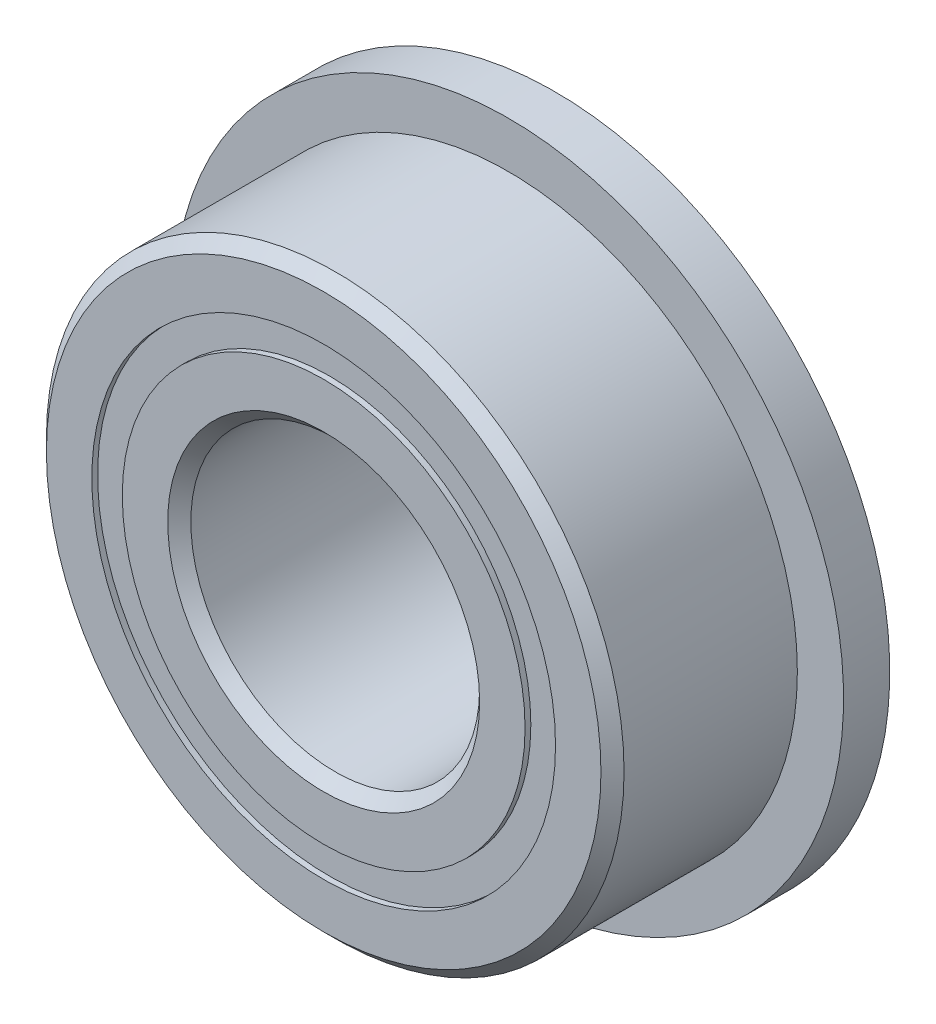
ISO-10303-21;
HEADER;
FILE_DESCRIPTION(('STEP AP214'),'2;1');
FILE_NAME('part.step','',(''),(''),'','','');
FILE_SCHEMA(('AUTOMOTIVE_DESIGN { 1 0 10303 214 1 1 1 1 }'));
ENDSEC;
DATA;
#1=APPLICATION_CONTEXT('core data for automotive mechanical design processes');
#2=APPLICATION_PROTOCOL_DEFINITION('international standard','automotive_design',2000,#1);
#3=PRODUCT_CONTEXT('',#1,'mechanical');
#4=PRODUCT('Part','Part','',(#3));
#5=PRODUCT_RELATED_PRODUCT_CATEGORY('part','',(#4));
#6=PRODUCT_DEFINITION_FORMATION('','',#4);
#7=PRODUCT_DEFINITION_CONTEXT('part definition',#1,'design');
#8=PRODUCT_DEFINITION('design','',#6,#7);
#9=PRODUCT_DEFINITION_SHAPE('','',#8);
#10=(LENGTH_UNIT() NAMED_UNIT(*) SI_UNIT(.MILLI.,.METRE.));
#11=(NAMED_UNIT(*) PLANE_ANGLE_UNIT() SI_UNIT($,.RADIAN.));
#12=(NAMED_UNIT(*) SI_UNIT($,.STERADIAN.) SOLID_ANGLE_UNIT());
#13=UNCERTAINTY_MEASURE_WITH_UNIT(LENGTH_MEASURE(1.E-05),#10,'distance_accuracy_value','');
#14=(GEOMETRIC_REPRESENTATION_CONTEXT(3) GLOBAL_UNCERTAINTY_ASSIGNED_CONTEXT((#13)) GLOBAL_UNIT_ASSIGNED_CONTEXT((#10,
#11,#12)) REPRESENTATION_CONTEXT('',''));
#15=CARTESIAN_POINT('',(0.,0.,0.));
#16=DIRECTION('',(0.,0.,1.));
#17=DIRECTION('',(1.,0.,0.));
#18=AXIS2_PLACEMENT_3D('',#15,#16,#17);
#19=CARTESIAN_POINT('',(0.,4.01373626373626,-1.9));
#20=DIRECTION('',(0.,0.,1.));
#21=DIRECTION('',(1.,0.,0.));
#22=AXIS2_PLACEMENT_3D('',#19,#20,#21);
#23=PLANE('',#22);
#24=CARTESIAN_POINT('',(0.,0.,-1.9));
#25=DIRECTION('',(0.,0.,1.));
#26=DIRECTION('',(1.,0.,0.));
#27=AXIS2_PLACEMENT_3D('',#24,#25,#26);
#28=CIRCLE('',#27,4.01373626373626);
#29=CARTESIAN_POINT('',(4.01373626373626,0.,-1.9));
#30=VERTEX_POINT('',#29);
#31=EDGE_CURVE('E57',#30,#30,#28,.T.);
#32=ORIENTED_EDGE('',*,*,#31,.F.);
#33=EDGE_LOOP('',(#32));
#34=FACE_BOUND('',#33,.T.);
#35=CARTESIAN_POINT('',(0.,0.,-1.9));
#36=DIRECTION('',(0.,0.,1.));
#37=DIRECTION('',(1.,0.,0.));
#38=AXIS2_PLACEMENT_3D('',#35,#36,#37);
#39=CIRCLE('',#38,3.48626373626374);
#40=CARTESIAN_POINT('',(3.48626373626374,0.,-1.9));
#41=VERTEX_POINT('',#40);
#42=EDGE_CURVE('E11',#41,#41,#39,.T.);
#43=ORIENTED_EDGE('',*,*,#42,.T.);
#44=EDGE_LOOP('',(#43));
#45=FACE_BOUND('',#44,.T.);
#46=ADVANCED_FACE('F43',(#34,#45),#23,.F.);
#47=CARTESIAN_POINT('',(0.,0.,2.));
#48=DIRECTION('',(0.,0.,1.));
#49=DIRECTION('',(1.,0.,0.));
#50=AXIS2_PLACEMENT_3D('',#47,#48,#49);
#51=CYLINDRICAL_SURFACE('',#50,3.48626373626374);
#52=ORIENTED_EDGE('',*,*,#42,.F.);
#53=EDGE_LOOP('',(#52));
#54=FACE_BOUND('',#53,.T.);
#55=CARTESIAN_POINT('',(0.,0.,-0.927189448602435));
#56=DIRECTION('',(0.,0.,1.));
#57=DIRECTION('',(1.,0.,0.));
#58=AXIS2_PLACEMENT_3D('',#55,#56,#57);
#59=CIRCLE('',#58,3.48626373626374);
#60=CARTESIAN_POINT('',(3.48626373626374,0.,-0.927189448602435));
#61=VERTEX_POINT('',#60);
#62=EDGE_CURVE('E49',#61,#61,#59,.T.);
#63=ORIENTED_EDGE('',*,*,#62,.T.);
#64=EDGE_LOOP('',(#63));
#65=FACE_BOUND('',#64,.T.);
#66=ADVANCED_FACE('F66',(#54,#65),#51,.F.);
#67=CARTESIAN_POINT('',(0.,4.01373626373626,-0.927189448602435));
#68=DIRECTION('',(0.,0.,-1.));
#69=DIRECTION('',(-1.,0.,0.));
#70=AXIS2_PLACEMENT_3D('',#67,#68,#69);
#71=PLANE('',#70);
#72=ORIENTED_EDGE('',*,*,#62,.F.);
#73=EDGE_LOOP('',(#72));
#74=FACE_BOUND('',#73,.T.);
#75=CARTESIAN_POINT('',(0.,0.,-0.927189448602435));
#76=DIRECTION('',(0.,0.,1.));
#77=DIRECTION('',(1.,0.,0.));
#78=AXIS2_PLACEMENT_3D('',#75,#76,#77);
#79=CIRCLE('',#78,4.01373626373626);
#80=CARTESIAN_POINT('',(4.01373626373626,0.,-0.927189448602435));
#81=VERTEX_POINT('',#80);
#82=EDGE_CURVE('E53',#81,#81,#79,.T.);
#83=ORIENTED_EDGE('',*,*,#82,.T.);
#84=EDGE_LOOP('',(#83));
#85=FACE_BOUND('',#84,.T.);
#86=ADVANCED_FACE('F70',(#74,#85),#71,.F.);
#87=CARTESIAN_POINT('',(0.,0.,2.));
#88=DIRECTION('',(0.,0.,1.));
#89=DIRECTION('',(1.,0.,0.));
#90=AXIS2_PLACEMENT_3D('',#87,#88,#89);
#91=CYLINDRICAL_SURFACE('',#90,4.01373626373626);
#92=ORIENTED_EDGE('',*,*,#82,.F.);
#93=EDGE_LOOP('',(#92));
#94=FACE_BOUND('',#93,.T.);
#95=ORIENTED_EDGE('',*,*,#31,.T.);
#96=EDGE_LOOP('',(#95));
#97=FACE_BOUND('',#96,.T.);
#98=ADVANCED_FACE('F63',(#94,#97),#91,.T.);
#99=CLOSED_SHELL('',(#46,#66,#86,#98));
#100=MANIFOLD_SOLID_BREP('B2',#99);
#101=CARTESIAN_POINT('',(0.,4.01373626373626,1.9));
#102=DIRECTION('',(0.,0.,-1.));
#103=DIRECTION('',(-1.,0.,0.));
#104=AXIS2_PLACEMENT_3D('',#101,#102,#103);
#105=PLANE('',#104);
#106=CARTESIAN_POINT('',(0.,0.,1.9));
#107=DIRECTION('',(0.,0.,1.));
#108=DIRECTION('',(1.,0.,0.));
#109=AXIS2_PLACEMENT_3D('',#106,#107,#108);
#110=CIRCLE('',#109,3.48626373626374);
#111=CARTESIAN_POINT('',(3.48626373626374,0.,1.9));
#112=VERTEX_POINT('',#111);
#113=EDGE_CURVE('E42',#112,#112,#110,.T.);
#114=ORIENTED_EDGE('',*,*,#113,.F.);
#115=EDGE_LOOP('',(#114));
#116=FACE_BOUND('',#115,.T.);
#117=CARTESIAN_POINT('',(0.,0.,1.9));
#118=DIRECTION('',(0.,0.,1.));
#119=DIRECTION('',(1.,0.,0.));
#120=AXIS2_PLACEMENT_3D('',#117,#118,#119);
#121=CIRCLE('',#120,4.01373626373626);
#122=CARTESIAN_POINT('',(4.01373626373626,0.,1.9));
#123=VERTEX_POINT('',#122);
#124=EDGE_CURVE('E124',#123,#123,#121,.T.);
#125=ORIENTED_EDGE('',*,*,#124,.T.);
#126=EDGE_LOOP('',(#125));
#127=FACE_BOUND('',#126,.T.);
#128=ADVANCED_FACE('F110',(#116,#127),#105,.F.);
#129=CARTESIAN_POINT('',(0.,0.,2.));
#130=DIRECTION('',(0.,0.,1.));
#131=DIRECTION('',(1.,0.,0.));
#132=AXIS2_PLACEMENT_3D('',#129,#130,#131);
#133=CYLINDRICAL_SURFACE('',#132,3.48626373626374);
#134=CARTESIAN_POINT('',(0.,0.,0.927189448602435));
#135=DIRECTION('',(0.,0.,1.));
#136=DIRECTION('',(1.,0.,0.));
#137=AXIS2_PLACEMENT_3D('',#134,#135,#136);
#138=CIRCLE('',#137,3.48626373626374);
#139=CARTESIAN_POINT('',(3.48626373626374,0.,0.927189448602435));
#140=VERTEX_POINT('',#139);
#141=EDGE_CURVE('E116',#140,#140,#138,.T.);
#142=ORIENTED_EDGE('',*,*,#141,.F.);
#143=EDGE_LOOP('',(#142));
#144=FACE_BOUND('',#143,.T.);
#145=ORIENTED_EDGE('',*,*,#113,.T.);
#146=EDGE_LOOP('',(#145));
#147=FACE_BOUND('',#146,.T.);
#148=ADVANCED_FACE('F139',(#144,#147),#133,.F.);
#149=CARTESIAN_POINT('',(0.,4.01373626373626,0.927189448602435));
#150=DIRECTION('',(0.,0.,1.));
#151=DIRECTION('',(1.,0.,0.));
#152=AXIS2_PLACEMENT_3D('',#149,#150,#151);
#153=PLANE('',#152);
#154=CARTESIAN_POINT('',(0.,0.,0.927189448602435));
#155=DIRECTION('',(0.,0.,1.));
#156=DIRECTION('',(1.,0.,0.));
#157=AXIS2_PLACEMENT_3D('',#154,#155,#156);
#158=CIRCLE('',#157,4.01373626373626);
#159=CARTESIAN_POINT('',(4.01373626373626,0.,0.927189448602435));
#160=VERTEX_POINT('',#159);
#161=EDGE_CURVE('E120',#160,#160,#158,.T.);
#162=ORIENTED_EDGE('',*,*,#161,.F.);
#163=EDGE_LOOP('',(#162));
#164=FACE_BOUND('',#163,.T.);
#165=ORIENTED_EDGE('',*,*,#141,.T.);
#166=EDGE_LOOP('',(#165));
#167=FACE_BOUND('',#166,.T.);
#168=ADVANCED_FACE('F134',(#164,#167),#153,.F.);
#169=CARTESIAN_POINT('',(0.,0.,2.));
#170=DIRECTION('',(0.,0.,1.));
#171=DIRECTION('',(1.,0.,0.));
#172=AXIS2_PLACEMENT_3D('',#169,#170,#171);
#173=CYLINDRICAL_SURFACE('',#172,4.01373626373626);
#174=ORIENTED_EDGE('',*,*,#124,.F.);
#175=EDGE_LOOP('',(#174));
#176=FACE_BOUND('',#175,.T.);
#177=ORIENTED_EDGE('',*,*,#161,.T.);
#178=EDGE_LOOP('',(#177));
#179=FACE_BOUND('',#178,.T.);
#180=ADVANCED_FACE('F131',(#176,#179),#173,.T.);
#181=CLOSED_SHELL('',(#128,#148,#168,#180));
#182=MANIFOLD_SOLID_BREP('B6',#181);
#183=CARTESIAN_POINT('',(-1.87499999999996,3.24759526419167,0.));
#184=DIRECTION('',(0.,0.,1.));
#185=DIRECTION('',(-0.499999999999989,0.866025403784445,0.));
#186=AXIS2_PLACEMENT_3D('',#183,#184,#185);
#187=SPHERICAL_SURFACE('',#186,0.927189448602435);
#188=CARTESIAN_POINT('',(-1.87499999999996,3.24759526419167,0.927189448602435));
#189=VERTEX_POINT('',#188);
#190=VERTEX_LOOP('',#189);
#191=FACE_BOUND('',#190,.T.);
#192=ADVANCED_FACE('F177',(#191),#187,.T.);
#193=CLOSED_SHELL('',(#192));
#194=MANIFOLD_SOLID_BREP('B37',#193);
#195=CARTESIAN_POINT('',(-3.24759526419162,1.87500000000004,0.));
#196=DIRECTION('',(0.,0.,1.));
#197=DIRECTION('',(-0.866025403784433,0.50000000000001,0.));
#198=AXIS2_PLACEMENT_3D('',#195,#196,#197);
#199=SPHERICAL_SURFACE('',#198,0.927189448602435);
#200=CARTESIAN_POINT('',(-3.24759526419162,1.87500000000004,0.927189448602435));
#201=VERTEX_POINT('',#200);
#202=VERTEX_LOOP('',#201);
#203=FACE_BOUND('',#202,.T.);
#204=ADVANCED_FACE('F197',(#203),#199,.T.);
#205=CLOSED_SHELL('',(#204));
#206=MANIFOLD_SOLID_BREP('B106',#205);
#207=CARTESIAN_POINT('',(-3.75,0.,0.));
#208=DIRECTION('',(0.,0.,1.));
#209=DIRECTION('',(-1.,0.,0.));
#210=AXIS2_PLACEMENT_3D('',#207,#208,#209);
#211=SPHERICAL_SURFACE('',#210,0.927189448602435);
#212=CARTESIAN_POINT('',(-3.75,0.,0.927189448602435));
#213=VERTEX_POINT('',#212);
#214=VERTEX_LOOP('',#213);
#215=FACE_BOUND('',#214,.T.);
#216=ADVANCED_FACE('F217',(#215),#211,.T.);
#217=CLOSED_SHELL('',(#216));
#218=MANIFOLD_SOLID_BREP('B173',#217);
#219=CARTESIAN_POINT('',(-3.24759526419166,-1.87499999999997,0.));
#220=DIRECTION('',(0.,0.,1.));
#221=DIRECTION('',(-0.866025403784443,-0.499999999999992,0.));
#222=AXIS2_PLACEMENT_3D('',#219,#220,#221);
#223=SPHERICAL_SURFACE('',#222,0.927189448602435);
#224=CARTESIAN_POINT('',(-3.24759526419166,-1.87499999999997,0.927189448602435));
#225=VERTEX_POINT('',#224);
#226=VERTEX_LOOP('',#225);
#227=FACE_BOUND('',#226,.T.);
#228=ADVANCED_FACE('F237',(#227),#223,.T.);
#229=CLOSED_SHELL('',(#228));
#230=MANIFOLD_SOLID_BREP('B193',#229);
#231=CARTESIAN_POINT('',(-1.87500000000003,-3.24759526419163,0.));
#232=DIRECTION('',(0.,0.,1.));
#233=DIRECTION('',(-0.500000000000007,-0.866025403784435,0.));
#234=AXIS2_PLACEMENT_3D('',#231,#232,#233);
#235=SPHERICAL_SURFACE('',#234,0.927189448602435);
#236=CARTESIAN_POINT('',(-1.87500000000003,-3.24759526419163,0.927189448602435));
#237=VERTEX_POINT('',#236);
#238=VERTEX_LOOP('',#237);
#239=FACE_BOUND('',#238,.T.);
#240=ADVANCED_FACE('F257',(#239),#235,.T.);
#241=CLOSED_SHELL('',(#240));
#242=MANIFOLD_SOLID_BREP('B213',#241);
#243=CARTESIAN_POINT('',(0.,-3.75,0.));
#244=DIRECTION('',(0.,0.,1.));
#245=DIRECTION('',(0.,-1.,0.));
#246=AXIS2_PLACEMENT_3D('',#243,#244,#245);
#247=SPHERICAL_SURFACE('',#246,0.927189448602435);
#248=CARTESIAN_POINT('',(0.,-3.75,0.927189448602435));
#249=VERTEX_POINT('',#248);
#250=VERTEX_LOOP('',#249);
#251=FACE_BOUND('',#250,.T.);
#252=ADVANCED_FACE('F277',(#251),#247,.T.);
#253=CLOSED_SHELL('',(#252));
#254=MANIFOLD_SOLID_BREP('B233',#253);
#255=CARTESIAN_POINT('',(1.87499999999998,-3.24759526419166,0.));
#256=DIRECTION('',(0.,0.,1.));
#257=DIRECTION('',(0.499999999999995,-0.866025403784442,0.));
#258=AXIS2_PLACEMENT_3D('',#255,#256,#257);
#259=SPHERICAL_SURFACE('',#258,0.927189448602435);
#260=CARTESIAN_POINT('',(1.87499999999998,-3.24759526419166,0.927189448602435));
#261=VERTEX_POINT('',#260);
#262=VERTEX_LOOP('',#261);
#263=FACE_BOUND('',#262,.T.);
#264=ADVANCED_FACE('F297',(#263),#259,.T.);
#265=CLOSED_SHELL('',(#264));
#266=MANIFOLD_SOLID_BREP('B253',#265);
#267=CARTESIAN_POINT('',(3.24759526419164,-1.87500000000002,0.));
#268=DIRECTION('',(0.,0.,1.));
#269=DIRECTION('',(0.866025403784436,-0.500000000000004,0.));
#270=AXIS2_PLACEMENT_3D('',#267,#268,#269);
#271=SPHERICAL_SURFACE('',#270,0.927189448602435);
#272=CARTESIAN_POINT('',(3.24759526419164,-1.87500000000002,0.927189448602435));
#273=VERTEX_POINT('',#272);
#274=VERTEX_LOOP('',#273);
#275=FACE_BOUND('',#274,.T.);
#276=ADVANCED_FACE('F317',(#275),#271,.T.);
#277=CLOSED_SHELL('',(#276));
#278=MANIFOLD_SOLID_BREP('B273',#277);
#279=CARTESIAN_POINT('',(3.75,0.,0.));
#280=DIRECTION('',(0.,0.,1.));
#281=DIRECTION('',(1.,0.,0.));
#282=AXIS2_PLACEMENT_3D('',#279,#280,#281);
#283=SPHERICAL_SURFACE('',#282,0.927189448602435);
#284=CARTESIAN_POINT('',(3.75,0.,0.927189448602435));
#285=VERTEX_POINT('',#284);
#286=VERTEX_LOOP('',#285);
#287=FACE_BOUND('',#286,.T.);
#288=ADVANCED_FACE('F337',(#287),#283,.T.);
#289=CLOSED_SHELL('',(#288));
#290=MANIFOLD_SOLID_BREP('B293',#289);
#291=CARTESIAN_POINT('',(3.24759526419165,1.87499999999999,0.));
#292=DIRECTION('',(0.,0.,1.));
#293=DIRECTION('',(0.86602540378444,0.499999999999998,0.));
#294=AXIS2_PLACEMENT_3D('',#291,#292,#293);
#295=SPHERICAL_SURFACE('',#294,0.927189448602435);
#296=CARTESIAN_POINT('',(3.24759526419165,1.87499999999999,0.927189448602435));
#297=VERTEX_POINT('',#296);
#298=VERTEX_LOOP('',#297);
#299=FACE_BOUND('',#298,.T.);
#300=ADVANCED_FACE('F357',(#299),#295,.T.);
#301=CLOSED_SHELL('',(#300));
#302=MANIFOLD_SOLID_BREP('B313',#301);
#303=CARTESIAN_POINT('',(1.875,3.24759526419164,0.));
#304=DIRECTION('',(0.,0.,1.));
#305=DIRECTION('',(0.500000000000001,0.866025403784438,0.));
#306=AXIS2_PLACEMENT_3D('',#303,#304,#305);
#307=SPHERICAL_SURFACE('',#306,0.927189448602435);
#308=CARTESIAN_POINT('',(1.875,3.24759526419164,0.927189448602435));
#309=VERTEX_POINT('',#308);
#310=VERTEX_LOOP('',#309);
#311=FACE_BOUND('',#310,.T.);
#312=ADVANCED_FACE('F377',(#311),#307,.T.);
#313=CLOSED_SHELL('',(#312));
#314=MANIFOLD_SOLID_BREP('B333',#313);
#315=CARTESIAN_POINT('',(0.,3.75,0.));
#316=DIRECTION('',(0.,0.,1.));
#317=DIRECTION('',(0.,1.,0.));
#318=AXIS2_PLACEMENT_3D('',#315,#316,#317);
#319=SPHERICAL_SURFACE('',#318,0.927189448602435);
#320=CARTESIAN_POINT('',(0.,3.75,0.927189448602435));
#321=VERTEX_POINT('',#320);
#322=VERTEX_LOOP('',#321);
#323=FACE_BOUND('',#322,.T.);
#324=ADVANCED_FACE('F399',(#323),#319,.T.);
#325=CLOSED_SHELL('',(#324));
#326=MANIFOLD_SOLID_BREP('B353',#325);
#327=CARTESIAN_POINT('',(0.,3.48626373626374,2.));
#328=DIRECTION('',(0.,0.,-1.));
#329=DIRECTION('',(-1.,0.,0.));
#330=AXIS2_PLACEMENT_3D('',#327,#328,#329);
#331=PLANE('',#330);
#332=CARTESIAN_POINT('',(0.,0.,2.));
#333=DIRECTION('',(0.,0.,1.));
#334=DIRECTION('',(1.,0.,0.));
#335=AXIS2_PLACEMENT_3D('',#332,#333,#334);
#336=CIRCLE('',#335,2.7);
#337=CARTESIAN_POINT('',(2.7,0.,2.));
#338=VERTEX_POINT('',#337);
#339=EDGE_CURVE('E446',#338,#338,#336,.T.);
#340=ORIENTED_EDGE('',*,*,#339,.F.);
#341=EDGE_LOOP('',(#340));
#342=FACE_BOUND('',#341,.T.);
#343=CARTESIAN_POINT('',(0.,0.,2.));
#344=DIRECTION('',(0.,0.,1.));
#345=DIRECTION('',(1.,0.,0.));
#346=AXIS2_PLACEMENT_3D('',#343,#344,#345);
#347=CIRCLE('',#346,3.48626373626374);
#348=CARTESIAN_POINT('',(3.48626373626374,0.,2.));
#349=VERTEX_POINT('',#348);
#350=EDGE_CURVE('E398',#349,#349,#347,.T.);
#351=ORIENTED_EDGE('',*,*,#350,.T.);
#352=EDGE_LOOP('',(#351));
#353=FACE_BOUND('',#352,.T.);
#354=ADVANCED_FACE('F418',(#342,#353),#331,.F.);
#355=CARTESIAN_POINT('',(0.,0.,2.));
#356=DIRECTION('',(0.,0.,1.));
#357=DIRECTION('',(1.,0.,0.));
#358=AXIS2_PLACEMENT_3D('',#355,#356,#357);
#359=CYLINDRICAL_SURFACE('',#358,3.48626373626374);
#360=ORIENTED_EDGE('',*,*,#350,.F.);
#361=EDGE_LOOP('',(#360));
#362=FACE_BOUND('',#361,.T.);
#363=CARTESIAN_POINT('',(0.,0.,0.888888888888889));
#364=DIRECTION('',(0.,0.,1.));
#365=DIRECTION('',(1.,0.,0.));
#366=AXIS2_PLACEMENT_3D('',#363,#364,#365);
#367=CIRCLE('',#366,3.48626373626374);
#368=CARTESIAN_POINT('',(3.48626373626374,0.,0.888888888888889));
#369=VERTEX_POINT('',#368);
#370=EDGE_CURVE('E424',#369,#369,#367,.T.);
#371=ORIENTED_EDGE('',*,*,#370,.T.);
#372=EDGE_LOOP('',(#371));
#373=FACE_BOUND('',#372,.T.);
#374=ADVANCED_FACE('F453',(#362,#373),#359,.T.);
#375=CARTESIAN_POINT('',(0.,0.,0.));
#376=DIRECTION('',(0.,0.,1.));
#377=DIRECTION('',(1.,0.,0.));
#378=AXIS2_PLACEMENT_3D('',#375,#376,#377);
#379=TOROIDAL_SURFACE('',#378,3.75,0.927189448602434);
#380=ORIENTED_EDGE('',*,*,#370,.F.);
#381=EDGE_LOOP('',(#380));
#382=FACE_BOUND('',#381,.T.);
#383=CARTESIAN_POINT('',(0.,0.,-0.88888888888889));
#384=DIRECTION('',(0.,0.,1.));
#385=DIRECTION('',(1.,0.,0.));
#386=AXIS2_PLACEMENT_3D('',#383,#384,#385);
#387=CIRCLE('',#386,3.48626373626374);
#388=CARTESIAN_POINT('',(3.48626373626374,0.,-0.88888888888889));
#389=VERTEX_POINT('',#388);
#390=EDGE_CURVE('E428',#389,#389,#387,.T.);
#391=ORIENTED_EDGE('',*,*,#390,.T.);
#392=EDGE_LOOP('',(#391));
#393=FACE_BOUND('',#392,.T.);
#394=ADVANCED_FACE('F457',(#382,#393),#379,.F.);
#395=CARTESIAN_POINT('',(0.,0.,2.));
#396=DIRECTION('',(0.,0.,1.));
#397=DIRECTION('',(1.,0.,0.));
#398=AXIS2_PLACEMENT_3D('',#395,#396,#397);
#399=CYLINDRICAL_SURFACE('',#398,3.48626373626374);
#400=ORIENTED_EDGE('',*,*,#390,.F.);
#401=EDGE_LOOP('',(#400));
#402=FACE_BOUND('',#401,.T.);
#403=CARTESIAN_POINT('',(0.,0.,-2.));
#404=DIRECTION('',(0.,0.,1.));
#405=DIRECTION('',(1.,0.,0.));
#406=AXIS2_PLACEMENT_3D('',#403,#404,#405);
#407=CIRCLE('',#406,3.48626373626374);
#408=CARTESIAN_POINT('',(3.48626373626374,0.,-2.));
#409=VERTEX_POINT('',#408);
#410=EDGE_CURVE('E432',#409,#409,#407,.T.);
#411=ORIENTED_EDGE('',*,*,#410,.T.);
#412=EDGE_LOOP('',(#411));
#413=FACE_BOUND('',#412,.T.);
#414=ADVANCED_FACE('F462',(#402,#413),#399,.T.);
#415=CARTESIAN_POINT('',(0.,2.7,-2.));
#416=DIRECTION('',(0.,0.,1.));
#417=DIRECTION('',(1.,0.,0.));
#418=AXIS2_PLACEMENT_3D('',#415,#416,#417);
#419=PLANE('',#418);
#420=ORIENTED_EDGE('',*,*,#410,.F.);
#421=EDGE_LOOP('',(#420));
#422=FACE_BOUND('',#421,.T.);
#423=CARTESIAN_POINT('',(0.,0.,-2.));
#424=DIRECTION('',(0.,0.,1.));
#425=DIRECTION('',(1.,0.,0.));
#426=AXIS2_PLACEMENT_3D('',#423,#424,#425);
#427=CIRCLE('',#426,2.7);
#428=CARTESIAN_POINT('',(2.7,0.,-2.));
#429=VERTEX_POINT('',#428);
#430=EDGE_CURVE('E437',#429,#429,#427,.T.);
#431=ORIENTED_EDGE('',*,*,#430,.T.);
#432=EDGE_LOOP('',(#431));
#433=FACE_BOUND('',#432,.T.);
#434=ADVANCED_FACE('F468',(#422,#433),#419,.F.);
#435=CARTESIAN_POINT('',(0.,0.,-1.8));
#436=DIRECTION('',(0.,0.,-1.));
#437=DIRECTION('',(-1.,0.,0.));
#438=AXIS2_PLACEMENT_3D('',#435,#436,#437);
#439=CONICAL_SURFACE('',#438,2.5,0.785398163397449);
#440=ORIENTED_EDGE('',*,*,#430,.F.);
#441=EDGE_LOOP('',(#440));
#442=FACE_BOUND('',#441,.T.);
#443=CARTESIAN_POINT('',(0.,0.,-1.8));
#444=DIRECTION('',(0.,0.,1.));
#445=DIRECTION('',(1.,0.,0.));
#446=AXIS2_PLACEMENT_3D('',#443,#444,#445);
#447=CIRCLE('',#446,2.5);
#448=CARTESIAN_POINT('',(2.5,0.,-1.8));
#449=VERTEX_POINT('',#448);
#450=EDGE_CURVE('E440',#449,#449,#447,.T.);
#451=ORIENTED_EDGE('',*,*,#450,.T.);
#452=EDGE_LOOP('',(#451));
#453=FACE_BOUND('',#452,.T.);
#454=ADVANCED_FACE('F472',(#442,#453),#439,.F.);
#455=CARTESIAN_POINT('',(0.,0.,2.));
#456=DIRECTION('',(0.,0.,1.));
#457=DIRECTION('',(1.,0.,0.));
#458=AXIS2_PLACEMENT_3D('',#455,#456,#457);
#459=CYLINDRICAL_SURFACE('',#458,2.5);
#460=ORIENTED_EDGE('',*,*,#450,.F.);
#461=EDGE_LOOP('',(#460));
#462=FACE_BOUND('',#461,.T.);
#463=CARTESIAN_POINT('',(0.,0.,1.8));
#464=DIRECTION('',(0.,0.,1.));
#465=DIRECTION('',(1.,0.,0.));
#466=AXIS2_PLACEMENT_3D('',#463,#464,#465);
#467=CIRCLE('',#466,2.5);
#468=CARTESIAN_POINT('',(2.5,0.,1.8));
#469=VERTEX_POINT('',#468);
#470=EDGE_CURVE('E443',#469,#469,#467,.T.);
#471=ORIENTED_EDGE('',*,*,#470,.T.);
#472=EDGE_LOOP('',(#471));
#473=FACE_BOUND('',#472,.T.);
#474=ADVANCED_FACE('F476',(#462,#473),#459,.F.);
#475=CARTESIAN_POINT('',(0.,0.,2.));
#476=DIRECTION('',(0.,0.,1.));
#477=DIRECTION('',(1.,0.,0.));
#478=AXIS2_PLACEMENT_3D('',#475,#476,#477);
#479=CONICAL_SURFACE('',#478,2.7,0.785398163397447);
#480=ORIENTED_EDGE('',*,*,#470,.F.);
#481=EDGE_LOOP('',(#480));
#482=FACE_BOUND('',#481,.T.);
#483=ORIENTED_EDGE('',*,*,#339,.T.);
#484=EDGE_LOOP('',(#483));
#485=FACE_BOUND('',#484,.T.);
#486=ADVANCED_FACE('F450',(#482,#485),#479,.F.);
#487=CLOSED_SHELL('',(#354,#374,#394,#414,#434,#454,#474,#486));
#488=MANIFOLD_SOLID_BREP('B373',#487);
#489=CARTESIAN_POINT('',(0.,0.,1.8));
#490=DIRECTION('',(0.,0.,-1.));
#491=DIRECTION('',(-1.,0.,0.));
#492=AXIS2_PLACEMENT_3D('',#489,#490,#491);
#493=CONICAL_SURFACE('',#492,5.,0.785398163397447);
#494=CARTESIAN_POINT('',(0.,0.,2.));
#495=DIRECTION('',(0.,0.,1.));
#496=DIRECTION('',(1.,0.,0.));
#497=AXIS2_PLACEMENT_3D('',#494,#495,#496);
#498=CIRCLE('',#497,4.8);
#499=CARTESIAN_POINT('',(4.8,0.,2.));
#500=VERTEX_POINT('',#499);
#501=EDGE_CURVE('E561',#500,#500,#498,.T.);
#502=ORIENTED_EDGE('',*,*,#501,.F.);
#503=EDGE_LOOP('',(#502));
#504=FACE_BOUND('',#503,.T.);
#505=CARTESIAN_POINT('',(0.,0.,1.8));
#506=DIRECTION('',(0.,0.,1.));
#507=DIRECTION('',(1.,0.,0.));
#508=AXIS2_PLACEMENT_3D('',#505,#506,#507);
#509=CIRCLE('',#508,5.);
#510=CARTESIAN_POINT('',(5.,0.,1.8));
#511=VERTEX_POINT('',#510);
#512=EDGE_CURVE('E417',#511,#511,#509,.T.);
#513=ORIENTED_EDGE('',*,*,#512,.T.);
#514=EDGE_LOOP('',(#513));
#515=FACE_BOUND('',#514,.T.);
#516=ADVANCED_FACE('F539',(#504,#515),#493,.T.);
#517=CARTESIAN_POINT('',(0.,0.,2.));
#518=DIRECTION('',(0.,0.,1.));
#519=DIRECTION('',(1.,0.,0.));
#520=AXIS2_PLACEMENT_3D('',#517,#518,#519);
#521=CYLINDRICAL_SURFACE('',#520,5.);
#522=CARTESIAN_POINT('',(0.,0.,-1.2));
#523=DIRECTION('',(0.,0.,1.));
#524=DIRECTION('',(1.,0.,0.));
#525=AXIS2_PLACEMENT_3D('',#522,#523,#524);
#526=CIRCLE('',#525,5.);
#527=CARTESIAN_POINT('',(5.,0.,-1.2));
#528=VERTEX_POINT('',#527);
#529=EDGE_CURVE('E564',#528,#528,#526,.T.);
#530=ORIENTED_EDGE('',*,*,#529,.T.);
#531=EDGE_LOOP('',(#530));
#532=FACE_BOUND('',#531,.T.);
#533=ORIENTED_EDGE('',*,*,#512,.F.);
#534=EDGE_LOOP('',(#533));
#535=FACE_BOUND('',#534,.T.);
#536=ADVANCED_FACE('F584',(#532,#535),#521,.T.);
#537=CARTESIAN_POINT('',(0.,4.8,-2.));
#538=DIRECTION('',(0.,0.,1.));
#539=DIRECTION('',(1.,0.,0.));
#540=AXIS2_PLACEMENT_3D('',#537,#538,#539);
#541=PLANE('',#540);
#542=CARTESIAN_POINT('',(0.,0.,-2.));
#543=DIRECTION('',(0.,0.,1.));
#544=DIRECTION('',(1.,0.,0.));
#545=AXIS2_PLACEMENT_3D('',#542,#543,#544);
#546=CIRCLE('',#545,4.01373626373626);
#547=CARTESIAN_POINT('',(4.01373626373626,0.,-2.));
#548=VERTEX_POINT('',#547);
#549=EDGE_CURVE('E545',#548,#548,#546,.T.);
#550=ORIENTED_EDGE('',*,*,#549,.T.);
#551=EDGE_LOOP('',(#550));
#552=FACE_BOUND('',#551,.T.);
#553=CARTESIAN_POINT('',(0.,0.,-2.));
#554=DIRECTION('',(0.,0.,-1.));
#555=DIRECTION('',(-1.,0.,0.));
#556=AXIS2_PLACEMENT_3D('',#553,#554,#555);
#557=CIRCLE('',#556,5.8);
#558=CARTESIAN_POINT('',(-5.8,0.,-2.));
#559=VERTEX_POINT('',#558);
#560=EDGE_CURVE('E567',#559,#559,#557,.T.);
#561=ORIENTED_EDGE('',*,*,#560,.T.);
#562=EDGE_LOOP('',(#561));
#563=FACE_BOUND('',#562,.T.);
#564=ADVANCED_FACE('F587',(#552,#563),#541,.F.);
#565=CARTESIAN_POINT('',(0.,0.,2.));
#566=DIRECTION('',(0.,0.,1.));
#567=DIRECTION('',(1.,0.,0.));
#568=AXIS2_PLACEMENT_3D('',#565,#566,#567);
#569=CYLINDRICAL_SURFACE('',#568,4.01373626373626);
#570=CARTESIAN_POINT('',(0.,0.,-0.888888888888889));
#571=DIRECTION('',(0.,0.,1.));
#572=DIRECTION('',(1.,0.,0.));
#573=AXIS2_PLACEMENT_3D('',#570,#571,#572);
#574=CIRCLE('',#573,4.01373626373626);
#575=CARTESIAN_POINT('',(4.01373626373626,0.,-0.888888888888889));
#576=VERTEX_POINT('',#575);
#577=EDGE_CURVE('E549',#576,#576,#574,.T.);
#578=ORIENTED_EDGE('',*,*,#577,.T.);
#579=EDGE_LOOP('',(#578));
#580=FACE_BOUND('',#579,.T.);
#581=ORIENTED_EDGE('',*,*,#549,.F.);
#582=EDGE_LOOP('',(#581));
#583=FACE_BOUND('',#582,.T.);
#584=ADVANCED_FACE('F592',(#580,#583),#569,.F.);
#585=CARTESIAN_POINT('',(0.,0.,0.));
#586=DIRECTION('',(0.,0.,1.));
#587=DIRECTION('',(1.,0.,0.));
#588=AXIS2_PLACEMENT_3D('',#585,#586,#587);
#589=TOROIDAL_SURFACE('',#588,3.75,0.927189448602435);
#590=ORIENTED_EDGE('',*,*,#577,.F.);
#591=EDGE_LOOP('',(#590));
#592=FACE_BOUND('',#591,.T.);
#593=CARTESIAN_POINT('',(0.,0.,0.888888888888889));
#594=DIRECTION('',(0.,0.,1.));
#595=DIRECTION('',(1.,0.,0.));
#596=AXIS2_PLACEMENT_3D('',#593,#594,#595);
#597=CIRCLE('',#596,4.01373626373626);
#598=CARTESIAN_POINT('',(4.01373626373626,0.,0.888888888888889));
#599=VERTEX_POINT('',#598);
#600=EDGE_CURVE('E553',#599,#599,#597,.T.);
#601=ORIENTED_EDGE('',*,*,#600,.T.);
#602=EDGE_LOOP('',(#601));
#603=FACE_BOUND('',#602,.T.);
#604=ADVANCED_FACE('F598',(#592,#603),#589,.F.);
#605=CARTESIAN_POINT('',(0.,0.,2.));
#606=DIRECTION('',(0.,0.,1.));
#607=DIRECTION('',(1.,0.,0.));
#608=AXIS2_PLACEMENT_3D('',#605,#606,#607);
#609=CYLINDRICAL_SURFACE('',#608,4.01373626373626);
#610=ORIENTED_EDGE('',*,*,#600,.F.);
#611=EDGE_LOOP('',(#610));
#612=FACE_BOUND('',#611,.T.);
#613=CARTESIAN_POINT('',(0.,0.,2.));
#614=DIRECTION('',(0.,0.,1.));
#615=DIRECTION('',(1.,0.,0.));
#616=AXIS2_PLACEMENT_3D('',#613,#614,#615);
#617=CIRCLE('',#616,4.01373626373626);
#618=CARTESIAN_POINT('',(4.01373626373626,0.,2.));
#619=VERTEX_POINT('',#618);
#620=EDGE_CURVE('E558',#619,#619,#617,.T.);
#621=ORIENTED_EDGE('',*,*,#620,.T.);
#622=EDGE_LOOP('',(#621));
#623=FACE_BOUND('',#622,.T.);
#624=ADVANCED_FACE('F602',(#612,#623),#609,.F.);
#625=CARTESIAN_POINT('',(0.,4.8,2.));
#626=DIRECTION('',(0.,0.,-1.));
#627=DIRECTION('',(-1.,0.,0.));
#628=AXIS2_PLACEMENT_3D('',#625,#626,#627);
#629=PLANE('',#628);
#630=ORIENTED_EDGE('',*,*,#620,.F.);
#631=EDGE_LOOP('',(#630));
#632=FACE_BOUND('',#631,.T.);
#633=ORIENTED_EDGE('',*,*,#501,.T.);
#634=EDGE_LOOP('',(#633));
#635=FACE_BOUND('',#634,.T.);
#636=ADVANCED_FACE('F580',(#632,#635),#629,.F.);
#637=CARTESIAN_POINT('',(0.,4.01373626373626,-1.2));
#638=DIRECTION('',(0.,0.,1.));
#639=DIRECTION('',(1.,0.,0.));
#640=AXIS2_PLACEMENT_3D('',#637,#638,#639);
#641=PLANE('',#640);
#642=CARTESIAN_POINT('',(0.,0.,-1.2));
#643=DIRECTION('',(0.,0.,-1.));
#644=DIRECTION('',(-1.,0.,0.));
#645=AXIS2_PLACEMENT_3D('',#642,#643,#644);
#646=CIRCLE('',#645,5.8);
#647=CARTESIAN_POINT('',(-5.8,0.,-1.2));
#648=VERTEX_POINT('',#647);
#649=EDGE_CURVE('E570',#648,#648,#646,.T.);
#650=ORIENTED_EDGE('',*,*,#649,.F.);
#651=EDGE_LOOP('',(#650));
#652=FACE_BOUND('',#651,.T.);
#653=ORIENTED_EDGE('',*,*,#529,.F.);
#654=EDGE_LOOP('',(#653));
#655=FACE_BOUND('',#654,.T.);
#656=ADVANCED_FACE('F577',(#652,#655),#641,.T.);
#657=CARTESIAN_POINT('',(0.,0.,-2.));
#658=DIRECTION('',(0.,0.,-1.));
#659=DIRECTION('',(-1.,0.,0.));
#660=AXIS2_PLACEMENT_3D('',#657,#658,#659);
#661=CYLINDRICAL_SURFACE('',#660,5.8);
#662=ORIENTED_EDGE('',*,*,#649,.T.);
#663=EDGE_LOOP('',(#662));
#664=FACE_BOUND('',#663,.T.);
#665=ORIENTED_EDGE('',*,*,#560,.F.);
#666=EDGE_LOOP('',(#665));
#667=FACE_BOUND('',#666,.T.);
#668=ADVANCED_FACE('F574',(#664,#667),#661,.T.);
#669=CLOSED_SHELL('',(#516,#536,#564,#584,#604,#624,#636,#656,#668));
#670=MANIFOLD_SOLID_BREP('B393',#669);
#671=ADVANCED_BREP_SHAPE_REPRESENTATION('',(#18,#100,#182,#194,#206,#218,#230,#242,#254,#266,
#278,#290,#302,#314,#326,#488,#670),#14);
#672=SHAPE_DEFINITION_REPRESENTATION(#9,#671);
ENDSEC;
END-ISO-10303-21;
